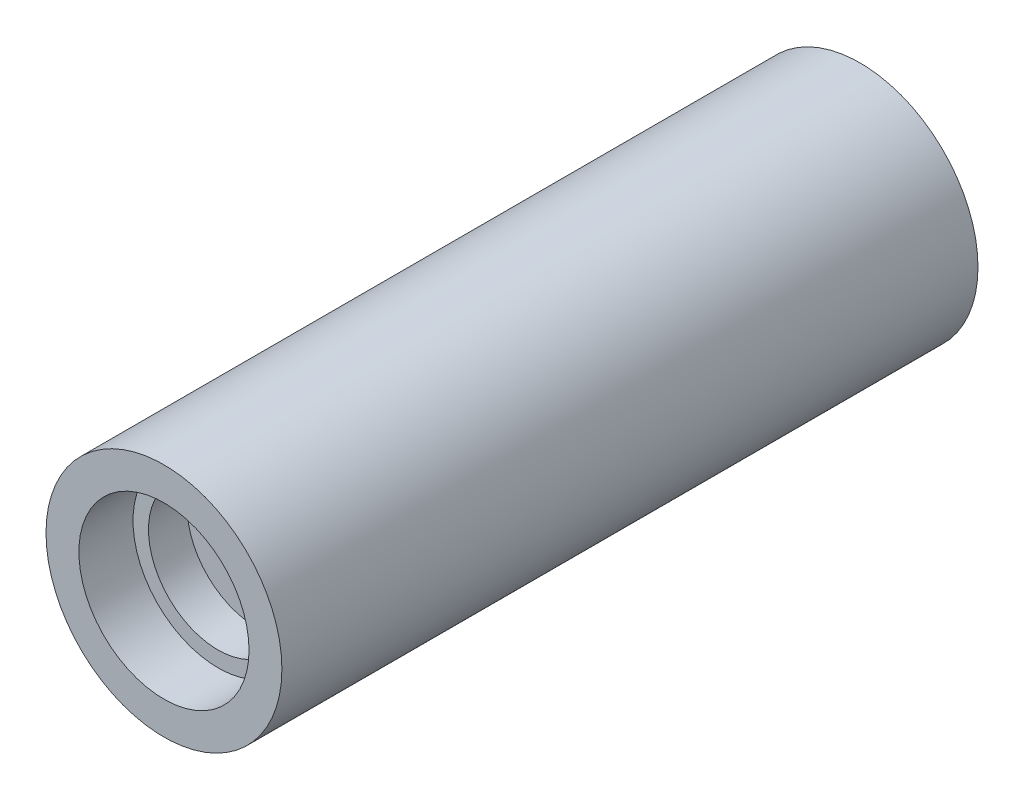
ISO-10303-21;
HEADER;
FILE_DESCRIPTION(('STEP AP214'),'2;1');
FILE_NAME('part.step','',(''),(''),'','','');
FILE_SCHEMA(('AUTOMOTIVE_DESIGN { 1 0 10303 214 1 1 1 1 }'));
ENDSEC;
DATA;
#1=APPLICATION_CONTEXT('core data for automotive mechanical design processes');
#2=APPLICATION_PROTOCOL_DEFINITION('international standard','automotive_design',2000,#1);
#3=PRODUCT_CONTEXT('',#1,'mechanical');
#4=PRODUCT('Part','Part','',(#3));
#5=PRODUCT_RELATED_PRODUCT_CATEGORY('part','',(#4));
#6=PRODUCT_DEFINITION_FORMATION('','',#4);
#7=PRODUCT_DEFINITION_CONTEXT('part definition',#1,'design');
#8=PRODUCT_DEFINITION('design','',#6,#7);
#9=PRODUCT_DEFINITION_SHAPE('','',#8);
#10=(LENGTH_UNIT() NAMED_UNIT(*) SI_UNIT(.MILLI.,.METRE.));
#11=(NAMED_UNIT(*) PLANE_ANGLE_UNIT() SI_UNIT($,.RADIAN.));
#12=(NAMED_UNIT(*) SI_UNIT($,.STERADIAN.) SOLID_ANGLE_UNIT());
#13=UNCERTAINTY_MEASURE_WITH_UNIT(LENGTH_MEASURE(1.E-05),#10,'distance_accuracy_value','');
#14=(GEOMETRIC_REPRESENTATION_CONTEXT(3) GLOBAL_UNCERTAINTY_ASSIGNED_CONTEXT((#13)) GLOBAL_UNIT_ASSIGNED_CONTEXT((#10,
#11,#12)) REPRESENTATION_CONTEXT('',''));
#15=CARTESIAN_POINT('',(0.,0.,0.));
#16=DIRECTION('',(0.,0.,1.));
#17=DIRECTION('',(1.,0.,0.));
#18=AXIS2_PLACEMENT_3D('',#15,#16,#17);
#19=CARTESIAN_POINT('',(0.,0.,90.));
#20=DIRECTION('',(0.,0.,-1.));
#21=DIRECTION('',(-1.,0.,0.));
#22=AXIS2_PLACEMENT_3D('',#19,#20,#21);
#23=CYLINDRICAL_SURFACE('',#22,15.25);
#24=CARTESIAN_POINT('',(0.,0.,90.));
#25=DIRECTION('',(0.,0.,1.));
#26=DIRECTION('',(1.,0.,0.));
#27=AXIS2_PLACEMENT_3D('',#24,#25,#26);
#28=CIRCLE('',#27,15.25);
#29=CARTESIAN_POINT('',(-15.25,0.,90.));
#30=VERTEX_POINT('',#29);
#31=EDGE_CURVE('E10',#30,#30,#28,.T.);
#32=CARTESIAN_POINT('',(0.,0.,0.));
#33=DIRECTION('',(0.,0.,1.));
#34=DIRECTION('',(1.,0.,0.));
#35=AXIS2_PLACEMENT_3D('',#32,#33,#34);
#36=CIRCLE('',#35,15.25);
#37=CARTESIAN_POINT('',(-15.25,0.,0.));
#38=VERTEX_POINT('',#37);
#39=EDGE_CURVE('E39',#38,#38,#36,.T.);
#40=CARTESIAN_POINT('',(-15.25,0.,90.));
#41=CARTESIAN_POINT('',(-15.25,0.,89.0625));
#42=CARTESIAN_POINT('',(-15.25,0.,88.125));
#43=CARTESIAN_POINT('',(-15.25,0.,86.25));
#44=CARTESIAN_POINT('',(-15.25,0.,85.3125));
#45=CARTESIAN_POINT('',(-15.25,0.,83.4375));
#46=CARTESIAN_POINT('',(-15.25,0.,82.5));
#47=CARTESIAN_POINT('',(-15.25,0.,80.625));
#48=CARTESIAN_POINT('',(-15.25,0.,79.6875));
#49=CARTESIAN_POINT('',(-15.25,0.,77.8125));
#50=CARTESIAN_POINT('',(-15.25,0.,76.875));
#51=CARTESIAN_POINT('',(-15.25,0.,75.));
#52=CARTESIAN_POINT('',(-15.25,0.,74.0625));
#53=CARTESIAN_POINT('',(-15.25,0.,72.1875));
#54=CARTESIAN_POINT('',(-15.25,0.,71.25));
#55=CARTESIAN_POINT('',(-15.25,0.,69.375));
#56=CARTESIAN_POINT('',(-15.25,0.,68.4375));
#57=CARTESIAN_POINT('',(-15.25,0.,66.5625));
#58=CARTESIAN_POINT('',(-15.25,0.,65.625));
#59=CARTESIAN_POINT('',(-15.25,0.,63.75));
#60=CARTESIAN_POINT('',(-15.25,0.,62.8125));
#61=CARTESIAN_POINT('',(-15.25,0.,60.9375));
#62=CARTESIAN_POINT('',(-15.25,0.,60.));
#63=CARTESIAN_POINT('',(-15.25,0.,58.125));
#64=CARTESIAN_POINT('',(-15.25,0.,57.1875));
#65=CARTESIAN_POINT('',(-15.25,0.,55.3125));
#66=CARTESIAN_POINT('',(-15.25,0.,54.375));
#67=CARTESIAN_POINT('',(-15.25,0.,52.5));
#68=CARTESIAN_POINT('',(-15.25,0.,51.5625));
#69=CARTESIAN_POINT('',(-15.25,0.,49.6875));
#70=CARTESIAN_POINT('',(-15.25,0.,48.75));
#71=CARTESIAN_POINT('',(-15.25,0.,46.875));
#72=CARTESIAN_POINT('',(-15.25,0.,45.9375));
#73=CARTESIAN_POINT('',(-15.25,0.,44.0625));
#74=CARTESIAN_POINT('',(-15.25,0.,43.125));
#75=CARTESIAN_POINT('',(-15.25,0.,41.25));
#76=CARTESIAN_POINT('',(-15.25,0.,40.3125));
#77=CARTESIAN_POINT('',(-15.25,0.,38.4375));
#78=CARTESIAN_POINT('',(-15.25,0.,37.5));
#79=CARTESIAN_POINT('',(-15.25,0.,35.625));
#80=CARTESIAN_POINT('',(-15.25,0.,34.6875));
#81=CARTESIAN_POINT('',(-15.25,0.,32.8125));
#82=CARTESIAN_POINT('',(-15.25,0.,31.875));
#83=CARTESIAN_POINT('',(-15.25,0.,30.));
#84=CARTESIAN_POINT('',(-15.25,0.,29.0625));
#85=CARTESIAN_POINT('',(-15.25,0.,27.1875));
#86=CARTESIAN_POINT('',(-15.25,0.,26.25));
#87=CARTESIAN_POINT('',(-15.25,0.,24.375));
#88=CARTESIAN_POINT('',(-15.25,0.,23.4375));
#89=CARTESIAN_POINT('',(-15.25,0.,21.5625));
#90=CARTESIAN_POINT('',(-15.25,0.,20.625));
#91=CARTESIAN_POINT('',(-15.25,0.,18.75));
#92=CARTESIAN_POINT('',(-15.25,0.,17.8125));
#93=CARTESIAN_POINT('',(-15.25,0.,15.9375));
#94=CARTESIAN_POINT('',(-15.25,0.,15.));
#95=CARTESIAN_POINT('',(-15.25,0.,13.125));
#96=CARTESIAN_POINT('',(-15.25,0.,12.1875));
#97=CARTESIAN_POINT('',(-15.25,0.,10.3125));
#98=CARTESIAN_POINT('',(-15.25,0.,9.37499999999999));
#99=CARTESIAN_POINT('',(-15.25,0.,7.49999999999999));
#100=CARTESIAN_POINT('',(-15.25,0.,6.56249999999999));
#101=CARTESIAN_POINT('',(-15.25,0.,4.68749999999999));
#102=CARTESIAN_POINT('',(-15.25,0.,3.74999999999998));
#103=CARTESIAN_POINT('',(-15.25,0.,1.87499999999998));
#104=CARTESIAN_POINT('',(-15.25,0.,0.937499999999986));
#105=CARTESIAN_POINT('',(-15.25,0.,0.));
#106=B_SPLINE_CURVE_WITH_KNOTS('',3,(#40,#41,#42,#43,#44,#45,#46,#47,#48,#49,#50,#51,#52,#53,
#54,#55,#56,#57,#58,#59,#60,#61,#62,#63,#64,#65,#66,#67,#68,#69,#70,#71,#72,#73,#74,#75,#76,#77,
#78,#79,#80,#81,#82,#83,#84,#85,#86,#87,#88,#89,#90,#91,#92,#93,#94,#95,#96,#97,#98,#99,#100,
#101,#102,#103,#104,#105),.UNSPECIFIED.,.F.,.F.,(4,2,2,2,2,2,2,2,2,2,2,2,2,2,2,2,2,2,2,2,2,2,2,
2,2,2,2,2,2,2,2,2,4),(0.,2.81250000000001,5.62500000000001,8.43750000000001,11.25,14.0625,
16.875,19.6875,22.5,25.3125,28.125,30.9375,33.75,36.5625,39.375,42.1875,45.,47.8125,50.625,
53.4375,56.25,59.0625,61.875,64.6875,67.5,70.3125,73.125,75.9375,78.75,81.5625,84.375,87.1875,
90.),.UNSPECIFIED.);
#107=EDGE_CURVE('BSEAM36',#30,#38,#106,.T.);
#108=ORIENTED_EDGE('',*,*,#31,.F.);
#109=ORIENTED_EDGE('',*,*,#39,.T.);
#110=ORIENTED_EDGE('',*,*,#107,.T.);
#111=ORIENTED_EDGE('',*,*,#107,.F.);
#112=EDGE_LOOP('',(#108,#110,#109,#111));
#113=FACE_BOUND('',#112,.T.);
#114=ADVANCED_FACE('F36',(#113),#23,.T.);
#115=CARTESIAN_POINT('',(0.,0.,90.));
#116=DIRECTION('',(0.,0.,1.));
#117=DIRECTION('',(1.,0.,0.));
#118=AXIS2_PLACEMENT_3D('',#115,#116,#117);
#119=PLANE('',#118);
#120=CARTESIAN_POINT('',(0.,0.,90.));
#121=DIRECTION('',(0.,0.,1.));
#122=DIRECTION('',(1.,0.,0.));
#123=AXIS2_PLACEMENT_3D('',#120,#121,#122);
#124=CIRCLE('',#123,11.);
#125=CARTESIAN_POINT('',(11.,0.,90.));
#126=VERTEX_POINT('',#125);
#127=EDGE_CURVE('E50',#126,#126,#124,.T.);
#128=ORIENTED_EDGE('',*,*,#127,.F.);
#129=EDGE_LOOP('',(#128));
#130=FACE_BOUND('',#129,.T.);
#131=ORIENTED_EDGE('',*,*,#31,.T.);
#132=EDGE_LOOP('',(#131));
#133=FACE_BOUND('',#132,.T.);
#134=ADVANCED_FACE('F94',(#130,#133),#119,.T.);
#135=CARTESIAN_POINT('',(0.,0.,0.));
#136=DIRECTION('',(0.,0.,1.));
#137=DIRECTION('',(1.,0.,0.));
#138=AXIS2_PLACEMENT_3D('',#135,#136,#137);
#139=PLANE('',#138);
#140=CARTESIAN_POINT('',(0.,0.,0.));
#141=DIRECTION('',(0.,0.,1.));
#142=DIRECTION('',(1.,0.,0.));
#143=AXIS2_PLACEMENT_3D('',#140,#141,#142);
#144=CIRCLE('',#143,11.);
#145=CARTESIAN_POINT('',(11.,0.,0.));
#146=VERTEX_POINT('',#145);
#147=EDGE_CURVE('E66',#146,#146,#144,.T.);
#148=ORIENTED_EDGE('',*,*,#147,.T.);
#149=EDGE_LOOP('',(#148));
#150=FACE_BOUND('',#149,.T.);
#151=ORIENTED_EDGE('',*,*,#39,.F.);
#152=EDGE_LOOP('',(#151));
#153=FACE_BOUND('',#152,.T.);
#154=ADVANCED_FACE('F100',(#150,#153),#139,.F.);
#155=CARTESIAN_POINT('',(0.,0.,83.));
#156=DIRECTION('',(0.,0.,1.));
#157=DIRECTION('',(1.,0.,0.));
#158=AXIS2_PLACEMENT_3D('',#155,#156,#157);
#159=CYLINDRICAL_SURFACE('',#158,11.);
#160=CARTESIAN_POINT('',(0.,0.,83.));
#161=DIRECTION('',(0.,0.,1.));
#162=DIRECTION('',(1.,0.,0.));
#163=AXIS2_PLACEMENT_3D('',#160,#161,#162);
#164=CIRCLE('',#163,11.);
#165=CARTESIAN_POINT('',(11.,0.,83.));
#166=VERTEX_POINT('',#165);
#167=EDGE_CURVE('E48',#166,#166,#164,.T.);
#168=ORIENTED_EDGE('',*,*,#167,.F.);
#169=EDGE_LOOP('',(#168));
#170=FACE_BOUND('',#169,.T.);
#171=ORIENTED_EDGE('',*,*,#127,.T.);
#172=EDGE_LOOP('',(#171));
#173=FACE_BOUND('',#172,.T.);
#174=ADVANCED_FACE('F107',(#170,#173),#159,.F.);
#175=CARTESIAN_POINT('',(0.,0.,83.));
#176=DIRECTION('',(0.,0.,1.));
#177=DIRECTION('',(1.,0.,0.));
#178=AXIS2_PLACEMENT_3D('',#175,#176,#177);
#179=PLANE('',#178);
#180=CARTESIAN_POINT('',(0.,0.,83.));
#181=DIRECTION('',(0.,0.,1.));
#182=DIRECTION('',(1.,0.,0.));
#183=AXIS2_PLACEMENT_3D('',#180,#181,#182);
#184=CIRCLE('',#183,9.);
#185=CARTESIAN_POINT('',(9.,0.,83.));
#186=VERTEX_POINT('',#185);
#187=EDGE_CURVE('E58',#186,#186,#184,.T.);
#188=ORIENTED_EDGE('',*,*,#187,.F.);
#189=EDGE_LOOP('',(#188));
#190=FACE_BOUND('',#189,.T.);
#191=ORIENTED_EDGE('',*,*,#167,.T.);
#192=EDGE_LOOP('',(#191));
#193=FACE_BOUND('',#192,.T.);
#194=ADVANCED_FACE('F114',(#190,#193),#179,.T.);
#195=CARTESIAN_POINT('',(0.,0.,78.));
#196=DIRECTION('',(0.,0.,1.));
#197=DIRECTION('',(1.,0.,0.));
#198=AXIS2_PLACEMENT_3D('',#195,#196,#197);
#199=CYLINDRICAL_SURFACE('',#198,9.);
#200=CARTESIAN_POINT('',(0.,0.,78.));
#201=DIRECTION('',(0.,0.,1.));
#202=DIRECTION('',(1.,0.,0.));
#203=AXIS2_PLACEMENT_3D('',#200,#201,#202);
#204=CIRCLE('',#203,9.);
#205=CARTESIAN_POINT('',(9.,0.,78.));
#206=VERTEX_POINT('',#205);
#207=EDGE_CURVE('E54',#206,#206,#204,.T.);
#208=ORIENTED_EDGE('',*,*,#207,.F.);
#209=EDGE_LOOP('',(#208));
#210=FACE_BOUND('',#209,.T.);
#211=ORIENTED_EDGE('',*,*,#187,.T.);
#212=EDGE_LOOP('',(#211));
#213=FACE_BOUND('',#212,.T.);
#214=ADVANCED_FACE('F120',(#210,#213),#199,.F.);
#215=CARTESIAN_POINT('',(0.,0.,78.));
#216=DIRECTION('',(0.,0.,1.));
#217=DIRECTION('',(1.,0.,0.));
#218=AXIS2_PLACEMENT_3D('',#215,#216,#217);
#219=PLANE('',#218);
#220=ORIENTED_EDGE('',*,*,#207,.T.);
#221=EDGE_LOOP('',(#220));
#222=FACE_BOUND('',#221,.T.);
#223=ADVANCED_FACE('F124',(#222),#219,.T.);
#224=CARTESIAN_POINT('',(0.,0.,7.));
#225=DIRECTION('',(0.,0.,-1.));
#226=DIRECTION('',(-1.,0.,0.));
#227=AXIS2_PLACEMENT_3D('',#224,#225,#226);
#228=CYLINDRICAL_SURFACE('',#227,11.);
#229=CARTESIAN_POINT('',(0.,0.,7.));
#230=DIRECTION('',(0.,0.,1.));
#231=DIRECTION('',(1.,0.,0.));
#232=AXIS2_PLACEMENT_3D('',#229,#230,#231);
#233=CIRCLE('',#232,11.);
#234=CARTESIAN_POINT('',(11.,0.,7.));
#235=VERTEX_POINT('',#234);
#236=EDGE_CURVE('E62',#235,#235,#233,.T.);
#237=ORIENTED_EDGE('',*,*,#236,.T.);
#238=EDGE_LOOP('',(#237));
#239=FACE_BOUND('',#238,.T.);
#240=ORIENTED_EDGE('',*,*,#147,.F.);
#241=EDGE_LOOP('',(#240));
#242=FACE_BOUND('',#241,.T.);
#243=ADVANCED_FACE('F128',(#239,#242),#228,.F.);
#244=CARTESIAN_POINT('',(0.,0.,7.));
#245=DIRECTION('',(0.,0.,-1.));
#246=DIRECTION('',(1.,0.,0.));
#247=AXIS2_PLACEMENT_3D('',#244,#245,#246);
#248=PLANE('',#247);
#249=CARTESIAN_POINT('',(0.,0.,7.00000000000001));
#250=DIRECTION('',(0.,0.,1.));
#251=DIRECTION('',(1.,0.,0.));
#252=AXIS2_PLACEMENT_3D('',#249,#250,#251);
#253=CIRCLE('',#252,9.);
#254=CARTESIAN_POINT('',(9.,0.,7.00000000000001));
#255=VERTEX_POINT('',#254);
#256=EDGE_CURVE('E74',#255,#255,#253,.T.);
#257=ORIENTED_EDGE('',*,*,#256,.T.);
#258=EDGE_LOOP('',(#257));
#259=FACE_BOUND('',#258,.T.);
#260=ORIENTED_EDGE('',*,*,#236,.F.);
#261=EDGE_LOOP('',(#260));
#262=FACE_BOUND('',#261,.T.);
#263=ADVANCED_FACE('F91',(#259,#262),#248,.T.);
#264=CARTESIAN_POINT('',(0.,0.,12.));
#265=DIRECTION('',(0.,0.,-1.));
#266=DIRECTION('',(-1.,0.,0.));
#267=AXIS2_PLACEMENT_3D('',#264,#265,#266);
#268=CYLINDRICAL_SURFACE('',#267,9.);
#269=CARTESIAN_POINT('',(0.,0.,12.));
#270=DIRECTION('',(0.,0.,1.));
#271=DIRECTION('',(1.,0.,0.));
#272=AXIS2_PLACEMENT_3D('',#269,#270,#271);
#273=CIRCLE('',#272,9.);
#274=CARTESIAN_POINT('',(9.,0.,12.));
#275=VERTEX_POINT('',#274);
#276=EDGE_CURVE('E70',#275,#275,#273,.T.);
#277=ORIENTED_EDGE('',*,*,#276,.T.);
#278=EDGE_LOOP('',(#277));
#279=FACE_BOUND('',#278,.T.);
#280=ORIENTED_EDGE('',*,*,#256,.F.);
#281=EDGE_LOOP('',(#280));
#282=FACE_BOUND('',#281,.T.);
#283=ADVANCED_FACE('F82',(#279,#282),#268,.F.);
#284=CARTESIAN_POINT('',(0.,0.,12.));
#285=DIRECTION('',(0.,0.,-1.));
#286=DIRECTION('',(1.,0.,0.));
#287=AXIS2_PLACEMENT_3D('',#284,#285,#286);
#288=PLANE('',#287);
#289=ORIENTED_EDGE('',*,*,#276,.F.);
#290=EDGE_LOOP('',(#289));
#291=FACE_BOUND('',#290,.T.);
#292=ADVANCED_FACE('F85',(#291),#288,.T.);
#293=CLOSED_SHELL('',(#114,#134,#154,#174,#194,#214,#223,#243,#263,#283,#292));
#294=MANIFOLD_SOLID_BREP('B2',#293);
#295=ADVANCED_BREP_SHAPE_REPRESENTATION('',(#18,#294),#14);
#296=SHAPE_DEFINITION_REPRESENTATION(#9,#295);
ENDSEC;
END-ISO-10303-21;
